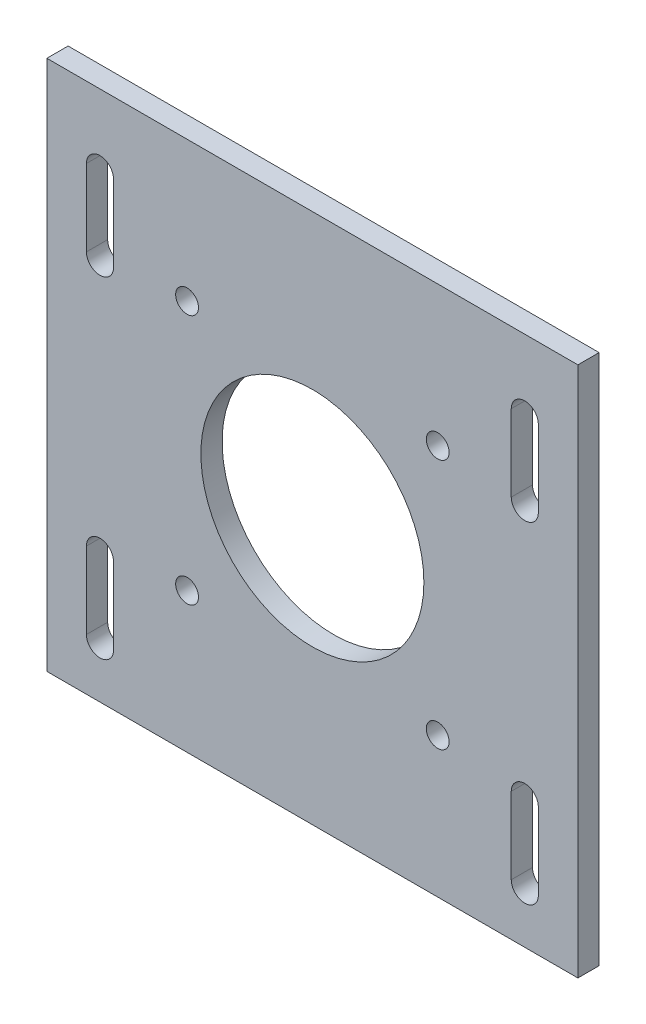
ISO-10303-21;
HEADER;
FILE_DESCRIPTION(('STEP AP214'),'2;1');
FILE_NAME('part.step','',(''),(''),'','','');
FILE_SCHEMA(('AUTOMOTIVE_DESIGN { 1 0 10303 214 1 1 1 1 }'));
ENDSEC;
DATA;
#1=APPLICATION_CONTEXT('core data for automotive mechanical design processes');
#2=APPLICATION_PROTOCOL_DEFINITION('international standard','automotive_design',2000,#1);
#3=PRODUCT_CONTEXT('',#1,'mechanical');
#4=PRODUCT('Part','Part','',(#3));
#5=PRODUCT_RELATED_PRODUCT_CATEGORY('part','',(#4));
#6=PRODUCT_DEFINITION_FORMATION('','',#4);
#7=PRODUCT_DEFINITION_CONTEXT('part definition',#1,'design');
#8=PRODUCT_DEFINITION('design','',#6,#7);
#9=PRODUCT_DEFINITION_SHAPE('','',#8);
#10=(LENGTH_UNIT() NAMED_UNIT(*) SI_UNIT(.MILLI.,.METRE.));
#11=(NAMED_UNIT(*) PLANE_ANGLE_UNIT() SI_UNIT($,.RADIAN.));
#12=(NAMED_UNIT(*) SI_UNIT($,.STERADIAN.) SOLID_ANGLE_UNIT());
#13=UNCERTAINTY_MEASURE_WITH_UNIT(LENGTH_MEASURE(1.E-05),#10,'distance_accuracy_value','');
#14=(GEOMETRIC_REPRESENTATION_CONTEXT(3) GLOBAL_UNCERTAINTY_ASSIGNED_CONTEXT((#13)) GLOBAL_UNIT_ASSIGNED_CONTEXT((#10,
#11,#12)) REPRESENTATION_CONTEXT('',''));
#15=CARTESIAN_POINT('',(0.,0.,0.));
#16=DIRECTION('',(0.,0.,1.));
#17=DIRECTION('',(1.,0.,0.));
#18=AXIS2_PLACEMENT_3D('',#15,#16,#17);
#19=CARTESIAN_POINT('',(0.,0.,4.));
#20=DIRECTION('',(0.,0.,1.));
#21=DIRECTION('',(1.,0.,0.));
#22=AXIS2_PLACEMENT_3D('',#19,#20,#21);
#23=PLANE('',#22);
#24=CARTESIAN_POINT('',(26.4,16.4,4.));
#25=DIRECTION('',(0.,0.,1.));
#26=DIRECTION('',(1.,0.,0.));
#27=AXIS2_PLACEMENT_3D('',#24,#25,#26);
#28=CIRCLE('',#27,2.15);
#29=CARTESIAN_POINT('',(28.55,16.4,4.));
#30=VERTEX_POINT('',#29);
#31=EDGE_CURVE('E222',#30,#30,#28,.T.);
#32=ORIENTED_EDGE('',*,*,#31,.F.);
#33=EDGE_LOOP('',(#32));
#34=FACE_BOUND('',#33,.T.);
#35=CARTESIAN_POINT('',(73.6,63.6,4.));
#36=DIRECTION('',(0.,0.,1.));
#37=DIRECTION('',(1.,0.,0.));
#38=AXIS2_PLACEMENT_3D('',#35,#36,#37);
#39=CIRCLE('',#38,2.15);
#40=CARTESIAN_POINT('',(75.75,63.6,4.));
#41=VERTEX_POINT('',#40);
#42=EDGE_CURVE('E234',#41,#41,#39,.T.);
#43=ORIENTED_EDGE('',*,*,#42,.F.);
#44=EDGE_LOOP('',(#43));
#45=FACE_BOUND('',#44,.T.);
#46=DIRECTION('',(0.,-1.,0.));
#47=VECTOR('',#46,1.);
#48=CARTESIAN_POINT('',(87.45,14.1724377602917,4.));
#49=LINE('',#48,#47);
#50=CARTESIAN_POINT('',(87.45,14.1724377602917,4.));
#51=VERTEX_POINT('',#50);
#52=CARTESIAN_POINT('',(87.45,-0.250300489708333,4.));
#53=VERTEX_POINT('',#52);
#54=EDGE_CURVE('E248',#51,#53,#49,.T.);
#55=ORIENTED_EDGE('',*,*,#54,.F.);
#56=CARTESIAN_POINT('',(90.,14.1724377602917,4.));
#57=DIRECTION('',(0.,0.,1.));
#58=DIRECTION('',(1.,0.,0.));
#59=AXIS2_PLACEMENT_3D('',#56,#57,#58);
#60=CIRCLE('',#59,2.55);
#61=CARTESIAN_POINT('',(92.55,14.1724377602917,4.));
#62=VERTEX_POINT('',#61);
#63=EDGE_CURVE('E246',#62,#51,#60,.T.);
#64=ORIENTED_EDGE('',*,*,#63,.F.);
#65=DIRECTION('',(0.,1.,0.));
#66=VECTOR('',#65,1.);
#67=CARTESIAN_POINT('',(92.55,14.1724377602917,4.));
#68=LINE('',#67,#66);
#69=CARTESIAN_POINT('',(92.55,-0.250300489708333,4.));
#70=VERTEX_POINT('',#69);
#71=EDGE_CURVE('E254',#70,#62,#68,.T.);
#72=ORIENTED_EDGE('',*,*,#71,.F.);
#73=CARTESIAN_POINT('',(90.,-0.250300489708333,4.));
#74=DIRECTION('',(0.,0.,1.));
#75=DIRECTION('',(1.,0.,0.));
#76=AXIS2_PLACEMENT_3D('',#73,#74,#75);
#77=CIRCLE('',#76,2.55);
#78=EDGE_CURVE('E251',#53,#70,#77,.T.);
#79=ORIENTED_EDGE('',*,*,#78,.F.);
#80=EDGE_LOOP('',(#55,#64,#72,#79));
#81=FACE_BOUND('',#80,.T.);
#82=DIRECTION('',(0.,1.,0.));
#83=VECTOR('',#82,1.);
#84=CARTESIAN_POINT('',(12.55,62.1505714186554,4.));
#85=LINE('',#84,#83);
#86=CARTESIAN_POINT('',(12.55,62.1505714186554,4.));
#87=VERTEX_POINT('',#86);
#88=CARTESIAN_POINT('',(12.55,76.5733096702234,4.));
#89=VERTEX_POINT('',#88);
#90=EDGE_CURVE('E279',#87,#89,#85,.T.);
#91=ORIENTED_EDGE('',*,*,#90,.F.);
#92=CARTESIAN_POINT('',(10.,62.1505714186554,4.));
#93=DIRECTION('',(0.,0.,1.));
#94=DIRECTION('',(-1.,0.,0.));
#95=AXIS2_PLACEMENT_3D('',#92,#93,#94);
#96=CIRCLE('',#95,2.54999999999998);
#97=CARTESIAN_POINT('',(7.45000000000004,62.1505714186554,4.));
#98=VERTEX_POINT('',#97);
#99=EDGE_CURVE('E277',#98,#87,#96,.T.);
#100=ORIENTED_EDGE('',*,*,#99,.F.);
#101=DIRECTION('',(0.,-1.,0.));
#102=VECTOR('',#101,1.);
#103=CARTESIAN_POINT('',(7.45000000000004,62.1505714186554,4.));
#104=LINE('',#103,#102);
#105=CARTESIAN_POINT('',(7.45,76.5733096702234,4.));
#106=VERTEX_POINT('',#105);
#107=EDGE_CURVE('E285',#106,#98,#104,.T.);
#108=ORIENTED_EDGE('',*,*,#107,.F.);
#109=CARTESIAN_POINT('',(10.,76.5733096702234,4.));
#110=DIRECTION('',(0.,0.,1.));
#111=DIRECTION('',(-1.,0.,0.));
#112=AXIS2_PLACEMENT_3D('',#109,#110,#111);
#113=CIRCLE('',#112,2.55000000000001);
#114=EDGE_CURVE('E282',#89,#106,#113,.T.);
#115=ORIENTED_EDGE('',*,*,#114,.F.);
#116=EDGE_LOOP('',(#91,#100,#108,#115));
#117=FACE_BOUND('',#116,.T.);
#118=DIRECTION('',(0.,-1.,0.));
#119=VECTOR('',#118,1.);
#120=CARTESIAN_POINT('',(7.45000000000001,14.1724377602917,4.));
#121=LINE('',#120,#119);
#122=CARTESIAN_POINT('',(7.45000000000001,14.1724377602917,4.));
#123=VERTEX_POINT('',#122);
#124=CARTESIAN_POINT('',(7.45000000000001,-0.250300489708305,4.));
#125=VERTEX_POINT('',#124);
#126=EDGE_CURVE('E310',#123,#125,#121,.T.);
#127=ORIENTED_EDGE('',*,*,#126,.F.);
#128=CARTESIAN_POINT('',(10.,14.1724377602917,4.));
#129=DIRECTION('',(0.,0.,1.));
#130=DIRECTION('',(-1.,0.,0.));
#131=AXIS2_PLACEMENT_3D('',#128,#129,#130);
#132=CIRCLE('',#131,2.55);
#133=CARTESIAN_POINT('',(12.55,14.1724377602917,4.));
#134=VERTEX_POINT('',#133);
#135=EDGE_CURVE('E308',#134,#123,#132,.T.);
#136=ORIENTED_EDGE('',*,*,#135,.F.);
#137=DIRECTION('',(0.,1.,0.));
#138=VECTOR('',#137,1.);
#139=CARTESIAN_POINT('',(12.55,14.1724377602917,4.));
#140=LINE('',#139,#138);
#141=CARTESIAN_POINT('',(12.55,-0.250300489708305,4.));
#142=VERTEX_POINT('',#141);
#143=EDGE_CURVE('E316',#142,#134,#140,.T.);
#144=ORIENTED_EDGE('',*,*,#143,.F.);
#145=CARTESIAN_POINT('',(10.,-0.250300489708305,4.));
#146=DIRECTION('',(0.,0.,1.));
#147=DIRECTION('',(-1.,0.,0.));
#148=AXIS2_PLACEMENT_3D('',#145,#146,#147);
#149=CIRCLE('',#148,2.55);
#150=EDGE_CURVE('E313',#125,#142,#149,.T.);
#151=ORIENTED_EDGE('',*,*,#150,.F.);
#152=EDGE_LOOP('',(#127,#136,#144,#151));
#153=FACE_BOUND('',#152,.T.);
#154=DIRECTION('',(0.,-1.,0.));
#155=VECTOR('',#154,1.);
#156=CARTESIAN_POINT('',(0.,0.,4.));
#157=LINE('',#156,#155);
#158=CARTESIAN_POINT('',(0.,90.,4.));
#159=VERTEX_POINT('',#158);
#160=CARTESIAN_POINT('',(0.,-10.,4.));
#161=VERTEX_POINT('',#160);
#162=EDGE_CURVE('E339',#159,#161,#157,.T.);
#163=ORIENTED_EDGE('',*,*,#162,.T.);
#164=DIRECTION('',(1.,0.,0.));
#165=VECTOR('',#164,1.);
#166=CARTESIAN_POINT('',(0.,-10.,4.));
#167=LINE('',#166,#165);
#168=CARTESIAN_POINT('',(100.,-10.,4.));
#169=VERTEX_POINT('',#168);
#170=EDGE_CURVE('E342',#161,#169,#167,.T.);
#171=ORIENTED_EDGE('',*,*,#170,.T.);
#172=DIRECTION('',(0.,1.,0.));
#173=VECTOR('',#172,1.);
#174=CARTESIAN_POINT('',(100.,-10.,4.));
#175=LINE('',#174,#173);
#176=CARTESIAN_POINT('',(100.,90.,4.));
#177=VERTEX_POINT('',#176);
#178=EDGE_CURVE('E345',#169,#177,#175,.T.);
#179=ORIENTED_EDGE('',*,*,#178,.T.);
#180=DIRECTION('',(-1.,0.,0.));
#181=VECTOR('',#180,1.);
#182=CARTESIAN_POINT('',(0.,90.,4.));
#183=LINE('',#182,#181);
#184=EDGE_CURVE('E347',#177,#159,#183,.T.);
#185=ORIENTED_EDGE('',*,*,#184,.T.);
#186=EDGE_LOOP('',(#163,#171,#179,#185));
#187=FACE_BOUND('',#186,.T.);
#188=CARTESIAN_POINT('',(26.4,63.6,4.));
#189=DIRECTION('',(0.,0.,1.));
#190=DIRECTION('',(1.,0.,0.));
#191=AXIS2_PLACEMENT_3D('',#188,#189,#190);
#192=CIRCLE('',#191,2.15);
#193=CARTESIAN_POINT('',(28.55,63.6,4.));
#194=VERTEX_POINT('',#193);
#195=EDGE_CURVE('E240',#194,#194,#192,.T.);
#196=ORIENTED_EDGE('',*,*,#195,.F.);
#197=EDGE_LOOP('',(#196));
#198=FACE_BOUND('',#197,.T.);
#199=CARTESIAN_POINT('',(73.6,16.4,4.));
#200=DIRECTION('',(0.,0.,1.));
#201=DIRECTION('',(1.,0.,0.));
#202=AXIS2_PLACEMENT_3D('',#199,#200,#201);
#203=CIRCLE('',#202,2.15);
#204=CARTESIAN_POINT('',(75.75,16.4,4.));
#205=VERTEX_POINT('',#204);
#206=EDGE_CURVE('E228',#205,#205,#203,.T.);
#207=ORIENTED_EDGE('',*,*,#206,.F.);
#208=EDGE_LOOP('',(#207));
#209=FACE_BOUND('',#208,.T.);
#210=CARTESIAN_POINT('',(50.,40.,4.));
#211=DIRECTION('',(0.,0.,1.));
#212=DIRECTION('',(1.,0.,0.));
#213=AXIS2_PLACEMENT_3D('',#210,#211,#212);
#214=CIRCLE('',#213,21.);
#215=CARTESIAN_POINT('',(71.,40.,4.));
#216=VERTEX_POINT('',#215);
#217=EDGE_CURVE('E216',#216,#216,#214,.T.);
#218=ORIENTED_EDGE('',*,*,#217,.F.);
#219=EDGE_LOOP('',(#218));
#220=FACE_BOUND('',#219,.T.);
#221=DIRECTION('',(0.,1.,0.));
#222=VECTOR('',#221,1.);
#223=CARTESIAN_POINT('',(92.55,62.1505714186554,4.));
#224=LINE('',#223,#222);
#225=CARTESIAN_POINT('',(92.55,62.1505714186554,4.));
#226=VERTEX_POINT('',#225);
#227=CARTESIAN_POINT('',(92.55,76.5733096702235,4.));
#228=VERTEX_POINT('',#227);
#229=EDGE_CURVE('E188',#226,#228,#224,.T.);
#230=ORIENTED_EDGE('',*,*,#229,.F.);
#231=CARTESIAN_POINT('',(90.,62.1505714186554,4.));
#232=DIRECTION('',(0.,0.,1.));
#233=DIRECTION('',(1.,0.,0.));
#234=AXIS2_PLACEMENT_3D('',#231,#232,#233);
#235=CIRCLE('',#234,2.54999999999998);
#236=CARTESIAN_POINT('',(87.45,62.1505714186554,4.));
#237=VERTEX_POINT('',#236);
#238=EDGE_CURVE('E180',#237,#226,#235,.T.);
#239=ORIENTED_EDGE('',*,*,#238,.F.);
#240=DIRECTION('',(0.,-1.,0.));
#241=VECTOR('',#240,1.);
#242=CARTESIAN_POINT('',(87.45,62.1505714186554,4.));
#243=LINE('',#242,#241);
#244=CARTESIAN_POINT('',(87.45,76.5733096702235,4.));
#245=VERTEX_POINT('',#244);
#246=EDGE_CURVE('E202',#245,#237,#243,.T.);
#247=ORIENTED_EDGE('',*,*,#246,.F.);
#248=CARTESIAN_POINT('',(90.,76.5733096702235,4.));
#249=DIRECTION('',(0.,0.,1.));
#250=DIRECTION('',(1.,0.,0.));
#251=AXIS2_PLACEMENT_3D('',#248,#249,#250);
#252=CIRCLE('',#251,2.55000000000001);
#253=EDGE_CURVE('E200',#228,#245,#252,.T.);
#254=ORIENTED_EDGE('',*,*,#253,.F.);
#255=EDGE_LOOP('',(#230,#239,#247,#254));
#256=FACE_BOUND('',#255,.T.);
#257=ADVANCED_FACE('F43',(#34,#45,#81,#117,#153,#187,#198,#209,#220,#256),#23,.T.);
#258=CARTESIAN_POINT('',(0.,0.,0.));
#259=DIRECTION('',(0.,0.,1.));
#260=DIRECTION('',(1.,0.,0.));
#261=AXIS2_PLACEMENT_3D('',#258,#259,#260);
#262=PLANE('',#261);
#263=CARTESIAN_POINT('',(50.,40.,0.));
#264=DIRECTION('',(0.,0.,1.));
#265=DIRECTION('',(1.,0.,0.));
#266=AXIS2_PLACEMENT_3D('',#263,#264,#265);
#267=CIRCLE('',#266,21.);
#268=CARTESIAN_POINT('',(71.,40.,0.));
#269=VERTEX_POINT('',#268);
#270=EDGE_CURVE('E196',#269,#269,#267,.T.);
#271=ORIENTED_EDGE('',*,*,#270,.T.);
#272=EDGE_LOOP('',(#271));
#273=FACE_BOUND('',#272,.T.);
#274=CARTESIAN_POINT('',(26.4,16.4,0.));
#275=DIRECTION('',(0.,0.,1.));
#276=DIRECTION('',(1.,0.,0.));
#277=AXIS2_PLACEMENT_3D('',#274,#275,#276);
#278=CIRCLE('',#277,2.15);
#279=CARTESIAN_POINT('',(28.55,16.4,0.));
#280=VERTEX_POINT('',#279);
#281=EDGE_CURVE('E219',#280,#280,#278,.T.);
#282=ORIENTED_EDGE('',*,*,#281,.T.);
#283=EDGE_LOOP('',(#282));
#284=FACE_BOUND('',#283,.T.);
#285=CARTESIAN_POINT('',(73.6,16.4,0.));
#286=DIRECTION('',(0.,0.,1.));
#287=DIRECTION('',(1.,0.,0.));
#288=AXIS2_PLACEMENT_3D('',#285,#286,#287);
#289=CIRCLE('',#288,2.15);
#290=CARTESIAN_POINT('',(75.75,16.4,0.));
#291=VERTEX_POINT('',#290);
#292=EDGE_CURVE('E225',#291,#291,#289,.T.);
#293=ORIENTED_EDGE('',*,*,#292,.T.);
#294=EDGE_LOOP('',(#293));
#295=FACE_BOUND('',#294,.T.);
#296=CARTESIAN_POINT('',(73.6,63.6,0.));
#297=DIRECTION('',(0.,0.,1.));
#298=DIRECTION('',(1.,0.,0.));
#299=AXIS2_PLACEMENT_3D('',#296,#297,#298);
#300=CIRCLE('',#299,2.15);
#301=CARTESIAN_POINT('',(75.75,63.6,0.));
#302=VERTEX_POINT('',#301);
#303=EDGE_CURVE('E231',#302,#302,#300,.T.);
#304=ORIENTED_EDGE('',*,*,#303,.T.);
#305=EDGE_LOOP('',(#304));
#306=FACE_BOUND('',#305,.T.);
#307=CARTESIAN_POINT('',(26.4,63.6,0.));
#308=DIRECTION('',(0.,0.,1.));
#309=DIRECTION('',(1.,0.,0.));
#310=AXIS2_PLACEMENT_3D('',#307,#308,#309);
#311=CIRCLE('',#310,2.15);
#312=CARTESIAN_POINT('',(28.55,63.6,0.));
#313=VERTEX_POINT('',#312);
#314=EDGE_CURVE('E237',#313,#313,#311,.T.);
#315=ORIENTED_EDGE('',*,*,#314,.T.);
#316=EDGE_LOOP('',(#315));
#317=FACE_BOUND('',#316,.T.);
#318=CARTESIAN_POINT('',(90.,14.1724377602917,0.));
#319=DIRECTION('',(0.,0.,1.));
#320=DIRECTION('',(1.,0.,0.));
#321=AXIS2_PLACEMENT_3D('',#318,#319,#320);
#322=CIRCLE('',#321,2.55);
#323=CARTESIAN_POINT('',(92.55,14.1724377602917,0.));
#324=VERTEX_POINT('',#323);
#325=CARTESIAN_POINT('',(87.45,14.1724377602917,0.));
#326=VERTEX_POINT('',#325);
#327=EDGE_CURVE('E243',#324,#326,#322,.T.);
#328=ORIENTED_EDGE('',*,*,#327,.T.);
#329=DIRECTION('',(0.,-1.,0.));
#330=VECTOR('',#329,1.);
#331=CARTESIAN_POINT('',(87.45,14.1724377602917,0.));
#332=LINE('',#331,#330);
#333=CARTESIAN_POINT('',(87.45,-0.250300489708333,0.));
#334=VERTEX_POINT('',#333);
#335=EDGE_CURVE('E259',#326,#334,#332,.T.);
#336=ORIENTED_EDGE('',*,*,#335,.T.);
#337=CARTESIAN_POINT('',(90.,-0.250300489708333,0.));
#338=DIRECTION('',(0.,0.,1.));
#339=DIRECTION('',(1.,0.,0.));
#340=AXIS2_PLACEMENT_3D('',#337,#338,#339);
#341=CIRCLE('',#340,2.55);
#342=CARTESIAN_POINT('',(92.55,-0.250300489708333,0.));
#343=VERTEX_POINT('',#342);
#344=EDGE_CURVE('E262',#334,#343,#341,.T.);
#345=ORIENTED_EDGE('',*,*,#344,.T.);
#346=DIRECTION('',(0.,1.,0.));
#347=VECTOR('',#346,1.);
#348=CARTESIAN_POINT('',(92.55,14.1724377602917,0.));
#349=LINE('',#348,#347);
#350=EDGE_CURVE('E249',#343,#324,#349,.T.);
#351=ORIENTED_EDGE('',*,*,#350,.T.);
#352=EDGE_LOOP('',(#328,#336,#345,#351));
#353=FACE_BOUND('',#352,.T.);
#354=CARTESIAN_POINT('',(10.,14.1724377602917,0.));
#355=DIRECTION('',(0.,0.,1.));
#356=DIRECTION('',(-1.,0.,0.));
#357=AXIS2_PLACEMENT_3D('',#354,#355,#356);
#358=CIRCLE('',#357,2.55);
#359=CARTESIAN_POINT('',(12.55,14.1724377602917,0.));
#360=VERTEX_POINT('',#359);
#361=CARTESIAN_POINT('',(7.45000000000001,14.1724377602917,0.));
#362=VERTEX_POINT('',#361);
#363=EDGE_CURVE('E307',#360,#362,#358,.T.);
#364=ORIENTED_EDGE('',*,*,#363,.T.);
#365=DIRECTION('',(0.,-1.,0.));
#366=VECTOR('',#365,1.);
#367=CARTESIAN_POINT('',(7.45000000000001,14.1724377602917,0.));
#368=LINE('',#367,#366);
#369=CARTESIAN_POINT('',(7.45000000000001,-0.250300489708305,0.));
#370=VERTEX_POINT('',#369);
#371=EDGE_CURVE('E321',#362,#370,#368,.T.);
#372=ORIENTED_EDGE('',*,*,#371,.T.);
#373=CARTESIAN_POINT('',(10.,-0.250300489708305,0.));
#374=DIRECTION('',(0.,0.,1.));
#375=DIRECTION('',(-1.,0.,0.));
#376=AXIS2_PLACEMENT_3D('',#373,#374,#375);
#377=CIRCLE('',#376,2.55);
#378=CARTESIAN_POINT('',(12.55,-0.250300489708305,0.));
#379=VERTEX_POINT('',#378);
#380=EDGE_CURVE('E324',#370,#379,#377,.T.);
#381=ORIENTED_EDGE('',*,*,#380,.T.);
#382=DIRECTION('',(0.,1.,0.));
#383=VECTOR('',#382,1.);
#384=CARTESIAN_POINT('',(12.55,14.1724377602917,0.));
#385=LINE('',#384,#383);
#386=EDGE_CURVE('E311',#379,#360,#385,.T.);
#387=ORIENTED_EDGE('',*,*,#386,.T.);
#388=EDGE_LOOP('',(#364,#372,#381,#387));
#389=FACE_BOUND('',#388,.T.);
#390=DIRECTION('',(1.,0.,0.));
#391=VECTOR('',#390,1.);
#392=CARTESIAN_POINT('',(0.,-10.,0.));
#393=LINE('',#392,#391);
#394=CARTESIAN_POINT('',(0.,-10.,0.));
#395=VERTEX_POINT('',#394);
#396=CARTESIAN_POINT('',(100.,-10.,0.));
#397=VERTEX_POINT('',#396);
#398=EDGE_CURVE('E338',#395,#397,#393,.T.);
#399=ORIENTED_EDGE('',*,*,#398,.F.);
#400=DIRECTION('',(0.,-1.,0.));
#401=VECTOR('',#400,1.);
#402=CARTESIAN_POINT('',(0.,0.,0.));
#403=LINE('',#402,#401);
#404=CARTESIAN_POINT('',(0.,90.,0.));
#405=VERTEX_POINT('',#404);
#406=EDGE_CURVE('E343',#405,#395,#403,.T.);
#407=ORIENTED_EDGE('',*,*,#406,.F.);
#408=DIRECTION('',(-1.,0.,0.));
#409=VECTOR('',#408,1.);
#410=CARTESIAN_POINT('',(0.,90.,0.));
#411=LINE('',#410,#409);
#412=CARTESIAN_POINT('',(100.,90.,0.));
#413=VERTEX_POINT('',#412);
#414=EDGE_CURVE('E355',#413,#405,#411,.T.);
#415=ORIENTED_EDGE('',*,*,#414,.F.);
#416=DIRECTION('',(0.,1.,0.));
#417=VECTOR('',#416,1.);
#418=CARTESIAN_POINT('',(100.,2.37229593660626,0.));
#419=LINE('',#418,#417);
#420=EDGE_CURVE('E353',#397,#413,#419,.T.);
#421=ORIENTED_EDGE('',*,*,#420,.F.);
#422=EDGE_LOOP('',(#399,#407,#415,#421));
#423=FACE_BOUND('',#422,.T.);
#424=CARTESIAN_POINT('',(10.,62.1505714186554,0.));
#425=DIRECTION('',(0.,0.,1.));
#426=DIRECTION('',(-1.,0.,0.));
#427=AXIS2_PLACEMENT_3D('',#424,#425,#426);
#428=CIRCLE('',#427,2.54999999999998);
#429=CARTESIAN_POINT('',(7.45000000000004,62.1505714186554,0.));
#430=VERTEX_POINT('',#429);
#431=CARTESIAN_POINT('',(12.55,62.1505714186554,0.));
#432=VERTEX_POINT('',#431);
#433=EDGE_CURVE('E276',#430,#432,#428,.T.);
#434=ORIENTED_EDGE('',*,*,#433,.T.);
#435=DIRECTION('',(0.,1.,0.));
#436=VECTOR('',#435,1.);
#437=CARTESIAN_POINT('',(12.55,62.1505714186554,0.));
#438=LINE('',#437,#436);
#439=CARTESIAN_POINT('',(12.55,76.5733096702234,0.));
#440=VERTEX_POINT('',#439);
#441=EDGE_CURVE('E290',#432,#440,#438,.T.);
#442=ORIENTED_EDGE('',*,*,#441,.T.);
#443=CARTESIAN_POINT('',(10.,76.5733096702234,0.));
#444=DIRECTION('',(0.,0.,1.));
#445=DIRECTION('',(-1.,0.,0.));
#446=AXIS2_PLACEMENT_3D('',#443,#444,#445);
#447=CIRCLE('',#446,2.55000000000001);
#448=CARTESIAN_POINT('',(7.45000000000001,76.5733096702234,0.));
#449=VERTEX_POINT('',#448);
#450=EDGE_CURVE('E293',#440,#449,#447,.T.);
#451=ORIENTED_EDGE('',*,*,#450,.T.);
#452=DIRECTION('',(0.,-1.,0.));
#453=VECTOR('',#452,1.);
#454=CARTESIAN_POINT('',(7.45000000000004,62.1505714186554,0.));
#455=LINE('',#454,#453);
#456=EDGE_CURVE('E280',#449,#430,#455,.T.);
#457=ORIENTED_EDGE('',*,*,#456,.T.);
#458=EDGE_LOOP('',(#434,#442,#451,#457));
#459=FACE_BOUND('',#458,.T.);
#460=CARTESIAN_POINT('',(90.,62.1505714186554,0.));
#461=DIRECTION('',(0.,0.,1.));
#462=DIRECTION('',(1.,0.,0.));
#463=AXIS2_PLACEMENT_3D('',#460,#461,#462);
#464=CIRCLE('',#463,2.54999999999998);
#465=CARTESIAN_POINT('',(87.45,62.1505714186554,0.));
#466=VERTEX_POINT('',#465);
#467=CARTESIAN_POINT('',(92.55,62.1505714186554,0.));
#468=VERTEX_POINT('',#467);
#469=EDGE_CURVE('E66',#466,#468,#464,.T.);
#470=ORIENTED_EDGE('',*,*,#469,.T.);
#471=DIRECTION('',(0.,1.,0.));
#472=VECTOR('',#471,1.);
#473=CARTESIAN_POINT('',(92.55,62.1505714186554,0.));
#474=LINE('',#473,#472);
#475=CARTESIAN_POINT('',(92.55,76.5733096702235,0.));
#476=VERTEX_POINT('',#475);
#477=EDGE_CURVE('E195',#468,#476,#474,.T.);
#478=ORIENTED_EDGE('',*,*,#477,.T.);
#479=CARTESIAN_POINT('',(90.,76.5733096702235,0.));
#480=DIRECTION('',(0.,0.,1.));
#481=DIRECTION('',(1.,0.,0.));
#482=AXIS2_PLACEMENT_3D('',#479,#480,#481);
#483=CIRCLE('',#482,2.55000000000001);
#484=CARTESIAN_POINT('',(87.45,76.5733096702235,0.));
#485=VERTEX_POINT('',#484);
#486=EDGE_CURVE('E208',#476,#485,#483,.T.);
#487=ORIENTED_EDGE('',*,*,#486,.T.);
#488=DIRECTION('',(0.,-1.,0.));
#489=VECTOR('',#488,1.);
#490=CARTESIAN_POINT('',(87.45,62.1505714186554,0.));
#491=LINE('',#490,#489);
#492=EDGE_CURVE('E189',#485,#466,#491,.T.);
#493=ORIENTED_EDGE('',*,*,#492,.T.);
#494=EDGE_LOOP('',(#470,#478,#487,#493));
#495=FACE_BOUND('',#494,.T.);
#496=ADVANCED_FACE('F373',(#273,#284,#295,#306,#317,#353,#389,#423,#459,#495),#262,.F.);
#497=CARTESIAN_POINT('',(0.,-10.,4.));
#498=DIRECTION('',(0.,1.,0.));
#499=DIRECTION('',(0.,0.,1.));
#500=AXIS2_PLACEMENT_3D('',#497,#498,#499);
#501=PLANE('',#500);
#502=ORIENTED_EDGE('',*,*,#398,.T.);
#503=DIRECTION('',(0.,0.,-1.));
#504=VECTOR('',#503,1.);
#505=CARTESIAN_POINT('',(100.,-10.,4.));
#506=LINE('',#505,#504);
#507=EDGE_CURVE('E51',#169,#397,#506,.T.);
#508=ORIENTED_EDGE('',*,*,#507,.F.);
#509=ORIENTED_EDGE('',*,*,#170,.F.);
#510=DIRECTION('',(0.,0.,-1.));
#511=VECTOR('',#510,1.);
#512=CARTESIAN_POINT('',(0.,-10.,4.));
#513=LINE('',#512,#511);
#514=EDGE_CURVE('E11',#161,#395,#513,.T.);
#515=ORIENTED_EDGE('',*,*,#514,.T.);
#516=EDGE_LOOP('',(#502,#508,#509,#515));
#517=FACE_BOUND('',#516,.T.);
#518=ADVANCED_FACE('F45',(#517),#501,.F.);
#519=CARTESIAN_POINT('',(100.,2.37229593660626,4.));
#520=DIRECTION('',(-1.,0.,0.));
#521=DIRECTION('',(0.,0.,1.));
#522=AXIS2_PLACEMENT_3D('',#519,#520,#521);
#523=PLANE('',#522);
#524=ORIENTED_EDGE('',*,*,#420,.T.);
#525=DIRECTION('',(0.,0.,-1.));
#526=VECTOR('',#525,1.);
#527=CARTESIAN_POINT('',(100.,90.,4.));
#528=LINE('',#527,#526);
#529=EDGE_CURVE('E360',#177,#413,#528,.T.);
#530=ORIENTED_EDGE('',*,*,#529,.F.);
#531=ORIENTED_EDGE('',*,*,#178,.F.);
#532=ORIENTED_EDGE('',*,*,#507,.T.);
#533=EDGE_LOOP('',(#524,#530,#531,#532));
#534=FACE_BOUND('',#533,.T.);
#535=ADVANCED_FACE('F366',(#534),#523,.F.);
#536=CARTESIAN_POINT('',(0.,90.,4.));
#537=DIRECTION('',(0.,-1.,0.));
#538=DIRECTION('',(1.,0.,0.));
#539=AXIS2_PLACEMENT_3D('',#536,#537,#538);
#540=PLANE('',#539);
#541=ORIENTED_EDGE('',*,*,#414,.T.);
#542=DIRECTION('',(0.,0.,-1.));
#543=VECTOR('',#542,1.);
#544=CARTESIAN_POINT('',(0.,90.,4.));
#545=LINE('',#544,#543);
#546=EDGE_CURVE('E350',#159,#405,#545,.T.);
#547=ORIENTED_EDGE('',*,*,#546,.F.);
#548=ORIENTED_EDGE('',*,*,#184,.F.);
#549=ORIENTED_EDGE('',*,*,#529,.T.);
#550=EDGE_LOOP('',(#541,#547,#548,#549));
#551=FACE_BOUND('',#550,.T.);
#552=ADVANCED_FACE('F378',(#551),#540,.F.);
#553=CARTESIAN_POINT('',(0.,0.,4.));
#554=DIRECTION('',(1.,0.,0.));
#555=DIRECTION('',(0.,0.,-1.));
#556=AXIS2_PLACEMENT_3D('',#553,#554,#555);
#557=PLANE('',#556);
#558=ORIENTED_EDGE('',*,*,#406,.T.);
#559=ORIENTED_EDGE('',*,*,#514,.F.);
#560=ORIENTED_EDGE('',*,*,#162,.F.);
#561=ORIENTED_EDGE('',*,*,#546,.T.);
#562=EDGE_LOOP('',(#558,#559,#560,#561));
#563=FACE_BOUND('',#562,.T.);
#564=ADVANCED_FACE('F381',(#563),#557,.F.);
#565=CARTESIAN_POINT('',(10.,14.1724377602917,4.));
#566=DIRECTION('',(0.,0.,-1.));
#567=DIRECTION('',(-1.,0.,0.));
#568=AXIS2_PLACEMENT_3D('',#565,#566,#567);
#569=CYLINDRICAL_SURFACE('',#568,2.55);
#570=ORIENTED_EDGE('',*,*,#363,.F.);
#571=DIRECTION('',(0.,0.,-1.));
#572=VECTOR('',#571,1.);
#573=CARTESIAN_POINT('',(12.55,14.1724377602917,4.));
#574=LINE('',#573,#572);
#575=EDGE_CURVE('E318',#134,#360,#574,.T.);
#576=ORIENTED_EDGE('',*,*,#575,.F.);
#577=ORIENTED_EDGE('',*,*,#135,.T.);
#578=DIRECTION('',(0.,0.,-1.));
#579=VECTOR('',#578,1.);
#580=CARTESIAN_POINT('',(7.45000000000001,14.1724377602917,4.));
#581=LINE('',#580,#579);
#582=EDGE_CURVE('E335',#123,#362,#581,.T.);
#583=ORIENTED_EDGE('',*,*,#582,.T.);
#584=EDGE_LOOP('',(#570,#576,#577,#583));
#585=FACE_BOUND('',#584,.T.);
#586=ADVANCED_FACE('F415',(#585),#569,.F.);
#587=CARTESIAN_POINT('',(7.45000000000001,14.1724377602917,4.));
#588=DIRECTION('',(1.,0.,0.));
#589=DIRECTION('',(0.,0.,-1.));
#590=AXIS2_PLACEMENT_3D('',#587,#588,#589);
#591=PLANE('',#590);
#592=ORIENTED_EDGE('',*,*,#371,.F.);
#593=ORIENTED_EDGE('',*,*,#582,.F.);
#594=ORIENTED_EDGE('',*,*,#126,.T.);
#595=DIRECTION('',(0.,0.,-1.));
#596=VECTOR('',#595,1.);
#597=CARTESIAN_POINT('',(7.45000000000001,-0.250300489708305,4.));
#598=LINE('',#597,#596);
#599=EDGE_CURVE('E333',#125,#370,#598,.T.);
#600=ORIENTED_EDGE('',*,*,#599,.T.);
#601=EDGE_LOOP('',(#592,#593,#594,#600));
#602=FACE_BOUND('',#601,.T.);
#603=ADVANCED_FACE('F425',(#602),#591,.T.);
#604=CARTESIAN_POINT('',(10.,-0.250300489708305,4.));
#605=DIRECTION('',(0.,0.,-1.));
#606=DIRECTION('',(-1.,0.,0.));
#607=AXIS2_PLACEMENT_3D('',#604,#605,#606);
#608=CYLINDRICAL_SURFACE('',#607,2.55);
#609=ORIENTED_EDGE('',*,*,#380,.F.);
#610=ORIENTED_EDGE('',*,*,#599,.F.);
#611=ORIENTED_EDGE('',*,*,#150,.T.);
#612=DIRECTION('',(0.,0.,-1.));
#613=VECTOR('',#612,1.);
#614=CARTESIAN_POINT('',(12.55,-0.250300489708305,4.));
#615=LINE('',#614,#613);
#616=EDGE_CURVE('E331',#142,#379,#615,.T.);
#617=ORIENTED_EDGE('',*,*,#616,.T.);
#618=EDGE_LOOP('',(#609,#610,#611,#617));
#619=FACE_BOUND('',#618,.T.);
#620=ADVANCED_FACE('F429',(#619),#608,.F.);
#621=CARTESIAN_POINT('',(12.55,14.1724377602917,4.));
#622=DIRECTION('',(-1.,0.,0.));
#623=DIRECTION('',(0.,0.,1.));
#624=AXIS2_PLACEMENT_3D('',#621,#622,#623);
#625=PLANE('',#624);
#626=ORIENTED_EDGE('',*,*,#386,.F.);
#627=ORIENTED_EDGE('',*,*,#616,.F.);
#628=ORIENTED_EDGE('',*,*,#143,.T.);
#629=ORIENTED_EDGE('',*,*,#575,.T.);
#630=EDGE_LOOP('',(#626,#627,#628,#629));
#631=FACE_BOUND('',#630,.T.);
#632=ADVANCED_FACE('F419',(#631),#625,.T.);
#633=CARTESIAN_POINT('',(10.,62.1505714186554,4.));
#634=DIRECTION('',(0.,0.,-1.));
#635=DIRECTION('',(-1.,0.,0.));
#636=AXIS2_PLACEMENT_3D('',#633,#634,#635);
#637=CYLINDRICAL_SURFACE('',#636,2.54999999999998);
#638=ORIENTED_EDGE('',*,*,#433,.F.);
#639=DIRECTION('',(0.,0.,-1.));
#640=VECTOR('',#639,1.);
#641=CARTESIAN_POINT('',(7.45000000000004,62.1505714186554,4.));
#642=LINE('',#641,#640);
#643=EDGE_CURVE('E287',#98,#430,#642,.T.);
#644=ORIENTED_EDGE('',*,*,#643,.F.);
#645=ORIENTED_EDGE('',*,*,#99,.T.);
#646=DIRECTION('',(0.,0.,-1.));
#647=VECTOR('',#646,1.);
#648=CARTESIAN_POINT('',(12.55,62.1505714186554,4.));
#649=LINE('',#648,#647);
#650=EDGE_CURVE('E304',#87,#432,#649,.T.);
#651=ORIENTED_EDGE('',*,*,#650,.T.);
#652=EDGE_LOOP('',(#638,#644,#645,#651));
#653=FACE_BOUND('',#652,.T.);
#654=ADVANCED_FACE('F436',(#653),#637,.F.);
#655=CARTESIAN_POINT('',(12.55,62.1505714186554,4.));
#656=DIRECTION('',(-1.,0.,0.));
#657=DIRECTION('',(0.,-1.,0.));
#658=AXIS2_PLACEMENT_3D('',#655,#656,#657);
#659=PLANE('',#658);
#660=ORIENTED_EDGE('',*,*,#441,.F.);
#661=ORIENTED_EDGE('',*,*,#650,.F.);
#662=ORIENTED_EDGE('',*,*,#90,.T.);
#663=DIRECTION('',(0.,0.,-1.));
#664=VECTOR('',#663,1.);
#665=CARTESIAN_POINT('',(12.55,76.5733096702234,4.));
#666=LINE('',#665,#664);
#667=EDGE_CURVE('E302',#89,#440,#666,.T.);
#668=ORIENTED_EDGE('',*,*,#667,.T.);
#669=EDGE_LOOP('',(#660,#661,#662,#668));
#670=FACE_BOUND('',#669,.T.);
#671=ADVANCED_FACE('F508',(#670),#659,.T.);
#672=CARTESIAN_POINT('',(10.,76.5733096702234,4.));
#673=DIRECTION('',(0.,0.,-1.));
#674=DIRECTION('',(-1.,0.,0.));
#675=AXIS2_PLACEMENT_3D('',#672,#673,#674);
#676=CYLINDRICAL_SURFACE('',#675,2.55000000000001);
#677=ORIENTED_EDGE('',*,*,#450,.F.);
#678=ORIENTED_EDGE('',*,*,#667,.F.);
#679=ORIENTED_EDGE('',*,*,#114,.T.);
#680=DIRECTION('',(0.,0.,-1.));
#681=VECTOR('',#680,1.);
#682=CARTESIAN_POINT('',(7.45000000000001,76.5733096702234,4.));
#683=LINE('',#682,#681);
#684=EDGE_CURVE('E300',#106,#449,#683,.T.);
#685=ORIENTED_EDGE('',*,*,#684,.T.);
#686=EDGE_LOOP('',(#677,#678,#679,#685));
#687=FACE_BOUND('',#686,.T.);
#688=ADVANCED_FACE('F516',(#687),#676,.F.);
#689=CARTESIAN_POINT('',(7.45000000000004,62.1505714186554,4.));
#690=DIRECTION('',(1.,0.,0.));
#691=DIRECTION('',(0.,1.,0.));
#692=AXIS2_PLACEMENT_3D('',#689,#690,#691);
#693=PLANE('',#692);
#694=ORIENTED_EDGE('',*,*,#456,.F.);
#695=ORIENTED_EDGE('',*,*,#684,.F.);
#696=ORIENTED_EDGE('',*,*,#107,.T.);
#697=ORIENTED_EDGE('',*,*,#643,.T.);
#698=EDGE_LOOP('',(#694,#695,#696,#697));
#699=FACE_BOUND('',#698,.T.);
#700=ADVANCED_FACE('F525',(#699),#693,.T.);
#701=CARTESIAN_POINT('',(90.,14.1724377602917,4.));
#702=DIRECTION('',(0.,0.,-1.));
#703=DIRECTION('',(-1.,0.,0.));
#704=AXIS2_PLACEMENT_3D('',#701,#702,#703);
#705=CYLINDRICAL_SURFACE('',#704,2.55);
#706=ORIENTED_EDGE('',*,*,#327,.F.);
#707=DIRECTION('',(0.,0.,-1.));
#708=VECTOR('',#707,1.);
#709=CARTESIAN_POINT('',(92.55,14.1724377602917,4.));
#710=LINE('',#709,#708);
#711=EDGE_CURVE('E256',#62,#324,#710,.T.);
#712=ORIENTED_EDGE('',*,*,#711,.F.);
#713=ORIENTED_EDGE('',*,*,#63,.T.);
#714=DIRECTION('',(0.,0.,-1.));
#715=VECTOR('',#714,1.);
#716=CARTESIAN_POINT('',(87.45,14.1724377602917,4.));
#717=LINE('',#716,#715);
#718=EDGE_CURVE('E273',#51,#326,#717,.T.);
#719=ORIENTED_EDGE('',*,*,#718,.T.);
#720=EDGE_LOOP('',(#706,#712,#713,#719));
#721=FACE_BOUND('',#720,.T.);
#722=ADVANCED_FACE('F534',(#721),#705,.F.);
#723=CARTESIAN_POINT('',(87.45,14.1724377602917,4.));
#724=DIRECTION('',(1.,0.,0.));
#725=DIRECTION('',(0.,0.,-1.));
#726=AXIS2_PLACEMENT_3D('',#723,#724,#725);
#727=PLANE('',#726);
#728=ORIENTED_EDGE('',*,*,#335,.F.);
#729=ORIENTED_EDGE('',*,*,#718,.F.);
#730=ORIENTED_EDGE('',*,*,#54,.T.);
#731=DIRECTION('',(0.,0.,-1.));
#732=VECTOR('',#731,1.);
#733=CARTESIAN_POINT('',(87.45,-0.250300489708333,4.));
#734=LINE('',#733,#732);
#735=EDGE_CURVE('E271',#53,#334,#734,.T.);
#736=ORIENTED_EDGE('',*,*,#735,.T.);
#737=EDGE_LOOP('',(#728,#729,#730,#736));
#738=FACE_BOUND('',#737,.T.);
#739=ADVANCED_FACE('F543',(#738),#727,.T.);
#740=CARTESIAN_POINT('',(90.,-0.250300489708333,4.));
#741=DIRECTION('',(0.,0.,-1.));
#742=DIRECTION('',(-1.,0.,0.));
#743=AXIS2_PLACEMENT_3D('',#740,#741,#742);
#744=CYLINDRICAL_SURFACE('',#743,2.55);
#745=ORIENTED_EDGE('',*,*,#344,.F.);
#746=ORIENTED_EDGE('',*,*,#735,.F.);
#747=ORIENTED_EDGE('',*,*,#78,.T.);
#748=DIRECTION('',(0.,0.,-1.));
#749=VECTOR('',#748,1.);
#750=CARTESIAN_POINT('',(92.55,-0.250300489708333,4.));
#751=LINE('',#750,#749);
#752=EDGE_CURVE('E269',#70,#343,#751,.T.);
#753=ORIENTED_EDGE('',*,*,#752,.T.);
#754=EDGE_LOOP('',(#745,#746,#747,#753));
#755=FACE_BOUND('',#754,.T.);
#756=ADVANCED_FACE('F552',(#755),#744,.F.);
#757=CARTESIAN_POINT('',(92.55,14.1724377602917,4.));
#758=DIRECTION('',(-1.,0.,0.));
#759=DIRECTION('',(0.,0.,1.));
#760=AXIS2_PLACEMENT_3D('',#757,#758,#759);
#761=PLANE('',#760);
#762=ORIENTED_EDGE('',*,*,#350,.F.);
#763=ORIENTED_EDGE('',*,*,#752,.F.);
#764=ORIENTED_EDGE('',*,*,#71,.T.);
#765=ORIENTED_EDGE('',*,*,#711,.T.);
#766=EDGE_LOOP('',(#762,#763,#764,#765));
#767=FACE_BOUND('',#766,.T.);
#768=ADVANCED_FACE('F561',(#767),#761,.T.);
#769=CARTESIAN_POINT('',(26.4,63.6,4.));
#770=DIRECTION('',(0.,0.,-1.));
#771=DIRECTION('',(-1.,0.,0.));
#772=AXIS2_PLACEMENT_3D('',#769,#770,#771);
#773=CYLINDRICAL_SURFACE('',#772,2.15);
#774=ORIENTED_EDGE('',*,*,#195,.T.);
#775=EDGE_LOOP('',(#774));
#776=FACE_BOUND('',#775,.T.);
#777=ORIENTED_EDGE('',*,*,#314,.F.);
#778=EDGE_LOOP('',(#777));
#779=FACE_BOUND('',#778,.T.);
#780=ADVANCED_FACE('F570',(#776,#779),#773,.F.);
#781=CARTESIAN_POINT('',(73.6,63.6,4.));
#782=DIRECTION('',(0.,0.,-1.));
#783=DIRECTION('',(-1.,0.,0.));
#784=AXIS2_PLACEMENT_3D('',#781,#782,#783);
#785=CYLINDRICAL_SURFACE('',#784,2.15);
#786=ORIENTED_EDGE('',*,*,#42,.T.);
#787=EDGE_LOOP('',(#786));
#788=FACE_BOUND('',#787,.T.);
#789=ORIENTED_EDGE('',*,*,#303,.F.);
#790=EDGE_LOOP('',(#789));
#791=FACE_BOUND('',#790,.T.);
#792=ADVANCED_FACE('F579',(#788,#791),#785,.F.);
#793=CARTESIAN_POINT('',(73.6,16.4,4.));
#794=DIRECTION('',(0.,0.,-1.));
#795=DIRECTION('',(-1.,0.,0.));
#796=AXIS2_PLACEMENT_3D('',#793,#794,#795);
#797=CYLINDRICAL_SURFACE('',#796,2.15);
#798=ORIENTED_EDGE('',*,*,#206,.T.);
#799=EDGE_LOOP('',(#798));
#800=FACE_BOUND('',#799,.T.);
#801=ORIENTED_EDGE('',*,*,#292,.F.);
#802=EDGE_LOOP('',(#801));
#803=FACE_BOUND('',#802,.T.);
#804=ADVANCED_FACE('F588',(#800,#803),#797,.F.);
#805=CARTESIAN_POINT('',(26.4,16.4,4.));
#806=DIRECTION('',(0.,0.,-1.));
#807=DIRECTION('',(-1.,0.,0.));
#808=AXIS2_PLACEMENT_3D('',#805,#806,#807);
#809=CYLINDRICAL_SURFACE('',#808,2.15);
#810=ORIENTED_EDGE('',*,*,#31,.T.);
#811=EDGE_LOOP('',(#810));
#812=FACE_BOUND('',#811,.T.);
#813=ORIENTED_EDGE('',*,*,#281,.F.);
#814=EDGE_LOOP('',(#813));
#815=FACE_BOUND('',#814,.T.);
#816=ADVANCED_FACE('F396',(#812,#815),#809,.F.);
#817=CARTESIAN_POINT('',(50.,40.,4.));
#818=DIRECTION('',(0.,0.,-1.));
#819=DIRECTION('',(-1.,0.,0.));
#820=AXIS2_PLACEMENT_3D('',#817,#818,#819);
#821=CYLINDRICAL_SURFACE('',#820,21.);
#822=ORIENTED_EDGE('',*,*,#217,.T.);
#823=EDGE_LOOP('',(#822));
#824=FACE_BOUND('',#823,.T.);
#825=ORIENTED_EDGE('',*,*,#270,.F.);
#826=EDGE_LOOP('',(#825));
#827=FACE_BOUND('',#826,.T.);
#828=ADVANCED_FACE('F393',(#824,#827),#821,.F.);
#829=CARTESIAN_POINT('',(90.,62.1505714186554,4.));
#830=DIRECTION('',(0.,0.,-1.));
#831=DIRECTION('',(-1.,0.,0.));
#832=AXIS2_PLACEMENT_3D('',#829,#830,#831);
#833=CYLINDRICAL_SURFACE('',#832,2.54999999999998);
#834=ORIENTED_EDGE('',*,*,#469,.F.);
#835=DIRECTION('',(0.,0.,-1.));
#836=VECTOR('',#835,1.);
#837=CARTESIAN_POINT('',(87.45,62.1505714186554,4.));
#838=LINE('',#837,#836);
#839=EDGE_CURVE('E184',#237,#466,#838,.T.);
#840=ORIENTED_EDGE('',*,*,#839,.F.);
#841=ORIENTED_EDGE('',*,*,#238,.T.);
#842=DIRECTION('',(0.,0.,-1.));
#843=VECTOR('',#842,1.);
#844=CARTESIAN_POINT('',(92.55,62.1505714186554,4.));
#845=LINE('',#844,#843);
#846=EDGE_CURVE('E183',#226,#468,#845,.T.);
#847=ORIENTED_EDGE('',*,*,#846,.T.);
#848=EDGE_LOOP('',(#834,#840,#841,#847));
#849=FACE_BOUND('',#848,.T.);
#850=ADVANCED_FACE('F182',(#849),#833,.F.);
#851=CARTESIAN_POINT('',(92.55,62.1505714186554,4.));
#852=DIRECTION('',(-1.,0.,0.));
#853=DIRECTION('',(0.,-1.,0.));
#854=AXIS2_PLACEMENT_3D('',#851,#852,#853);
#855=PLANE('',#854);
#856=ORIENTED_EDGE('',*,*,#477,.F.);
#857=ORIENTED_EDGE('',*,*,#846,.F.);
#858=ORIENTED_EDGE('',*,*,#229,.T.);
#859=DIRECTION('',(0.,0.,-1.));
#860=VECTOR('',#859,1.);
#861=CARTESIAN_POINT('',(92.55,76.5733096702235,4.));
#862=LINE('',#861,#860);
#863=EDGE_CURVE('E197',#228,#476,#862,.T.);
#864=ORIENTED_EDGE('',*,*,#863,.T.);
#865=EDGE_LOOP('',(#856,#857,#858,#864));
#866=FACE_BOUND('',#865,.T.);
#867=ADVANCED_FACE('F192',(#866),#855,.T.);
#868=CARTESIAN_POINT('',(90.,76.5733096702235,4.));
#869=DIRECTION('',(0.,0.,-1.));
#870=DIRECTION('',(-1.,0.,0.));
#871=AXIS2_PLACEMENT_3D('',#868,#869,#870);
#872=CYLINDRICAL_SURFACE('',#871,2.55000000000001);
#873=ORIENTED_EDGE('',*,*,#486,.F.);
#874=ORIENTED_EDGE('',*,*,#863,.F.);
#875=ORIENTED_EDGE('',*,*,#253,.T.);
#876=DIRECTION('',(0.,0.,-1.));
#877=VECTOR('',#876,1.);
#878=CARTESIAN_POINT('',(87.45,76.5733096702235,4.));
#879=LINE('',#878,#877);
#880=EDGE_CURVE('E58',#245,#485,#879,.T.);
#881=ORIENTED_EDGE('',*,*,#880,.T.);
#882=EDGE_LOOP('',(#873,#874,#875,#881));
#883=FACE_BOUND('',#882,.T.);
#884=ADVANCED_FACE('F625',(#883),#872,.F.);
#885=CARTESIAN_POINT('',(87.45,62.1505714186554,4.));
#886=DIRECTION('',(1.,0.,0.));
#887=DIRECTION('',(0.,1.,0.));
#888=AXIS2_PLACEMENT_3D('',#885,#886,#887);
#889=PLANE('',#888);
#890=ORIENTED_EDGE('',*,*,#492,.F.);
#891=ORIENTED_EDGE('',*,*,#880,.F.);
#892=ORIENTED_EDGE('',*,*,#246,.T.);
#893=ORIENTED_EDGE('',*,*,#839,.T.);
#894=EDGE_LOOP('',(#890,#891,#892,#893));
#895=FACE_BOUND('',#894,.T.);
#896=ADVANCED_FACE('F633',(#895),#889,.T.);
#897=CLOSED_SHELL('',(#257,#496,#518,#535,#552,#564,#586,#603,#620,#632,#654,#671,#688,#700,
#722,#739,#756,#768,#780,#792,#804,#816,#828,#850,#867,#884,#896));
#898=MANIFOLD_SOLID_BREP('B2',#897);
#899=ADVANCED_BREP_SHAPE_REPRESENTATION('',(#18,#898),#14);
#900=SHAPE_DEFINITION_REPRESENTATION(#9,#899);
ENDSEC;
END-ISO-10303-21;
